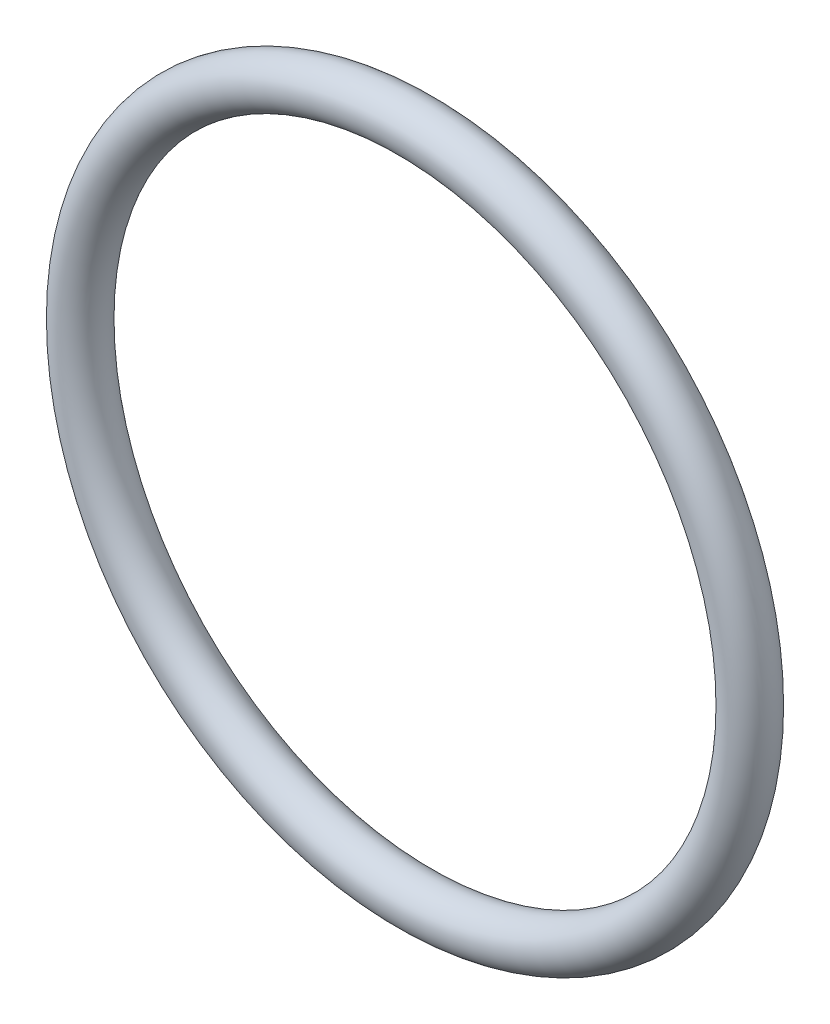
ISO-10303-21;
HEADER;
FILE_DESCRIPTION(('STEP AP214'),'2;1');
FILE_NAME('part.step','',(''),(''),'','','');
FILE_SCHEMA(('AUTOMOTIVE_DESIGN { 1 0 10303 214 1 1 1 1 }'));
ENDSEC;
DATA;
#1=APPLICATION_CONTEXT('core data for automotive mechanical design processes');
#2=APPLICATION_PROTOCOL_DEFINITION('international standard','automotive_design',2000,#1);
#3=PRODUCT_CONTEXT('',#1,'mechanical');
#4=PRODUCT('Part','Part','',(#3));
#5=PRODUCT_RELATED_PRODUCT_CATEGORY('part','',(#4));
#6=PRODUCT_DEFINITION_FORMATION('','',#4);
#7=PRODUCT_DEFINITION_CONTEXT('part definition',#1,'design');
#8=PRODUCT_DEFINITION('design','',#6,#7);
#9=PRODUCT_DEFINITION_SHAPE('','',#8);
#10=(LENGTH_UNIT() NAMED_UNIT(*) SI_UNIT(.MILLI.,.METRE.));
#11=(NAMED_UNIT(*) PLANE_ANGLE_UNIT() SI_UNIT($,.RADIAN.));
#12=(NAMED_UNIT(*) SI_UNIT($,.STERADIAN.) SOLID_ANGLE_UNIT());
#13=UNCERTAINTY_MEASURE_WITH_UNIT(LENGTH_MEASURE(1.E-05),#10,'distance_accuracy_value','');
#14=(GEOMETRIC_REPRESENTATION_CONTEXT(3) GLOBAL_UNCERTAINTY_ASSIGNED_CONTEXT((#13)) GLOBAL_UNIT_ASSIGNED_CONTEXT((#10,
#11,#12)) REPRESENTATION_CONTEXT('',''));
#15=CARTESIAN_POINT('',(0.,0.,0.));
#16=DIRECTION('',(0.,0.,1.));
#17=DIRECTION('',(1.,0.,0.));
#18=AXIS2_PLACEMENT_3D('',#15,#16,#17);
#19=CARTESIAN_POINT('',(0.,0.,0.));
#20=DIRECTION('',(0.,0.,1.));
#21=DIRECTION('',(1.,0.,0.));
#22=AXIS2_PLACEMENT_3D('',#19,#20,#21);
#23=TOROIDAL_SURFACE('',#22,21.,1.5);
#24=CARTESIAN_POINT('',(22.5,0.,0.));
#25=VERTEX_POINT('',#24);
#26=VERTEX_LOOP('',#25);
#27=FACE_BOUND('',#26,.T.);
#28=ADVANCED_FACE('F28',(#27),#23,.T.);
#29=CLOSED_SHELL('',(#28));
#30=MANIFOLD_SOLID_BREP('B2',#29);
#31=ADVANCED_BREP_SHAPE_REPRESENTATION('',(#18,#30),#14);
#32=SHAPE_DEFINITION_REPRESENTATION(#9,#31);
ENDSEC;
END-ISO-10303-21;
